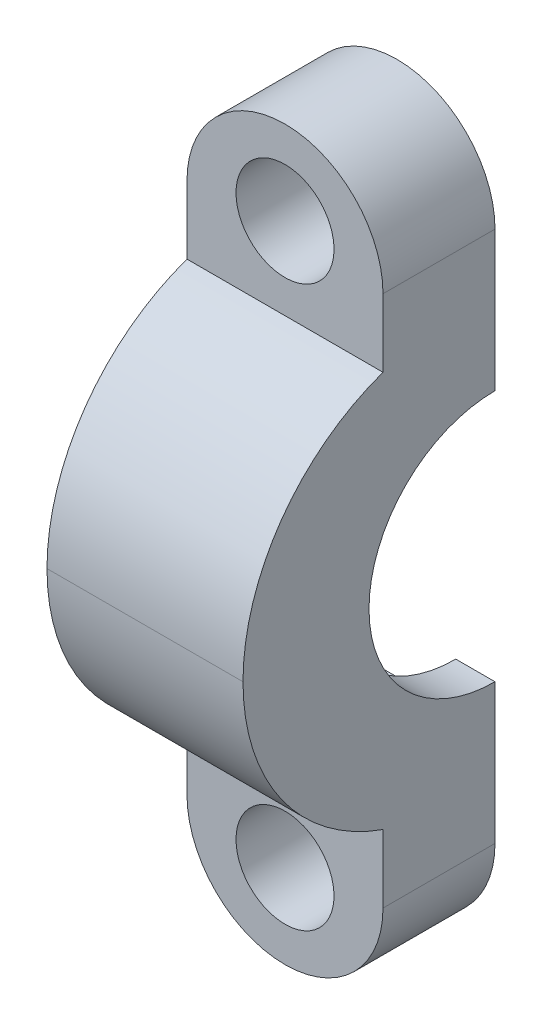
ISO-10303-21;
HEADER;
FILE_DESCRIPTION(('STEP AP214'),'2;1');
FILE_NAME('part.step','',(''),(''),'','','');
FILE_SCHEMA(('AUTOMOTIVE_DESIGN { 1 0 10303 214 1 1 1 1 }'));
ENDSEC;
DATA;
#1=APPLICATION_CONTEXT('core data for automotive mechanical design processes');
#2=APPLICATION_PROTOCOL_DEFINITION('international standard','automotive_design',2000,#1);
#3=PRODUCT_CONTEXT('',#1,'mechanical');
#4=PRODUCT('Part','Part','',(#3));
#5=PRODUCT_RELATED_PRODUCT_CATEGORY('part','',(#4));
#6=PRODUCT_DEFINITION_FORMATION('','',#4);
#7=PRODUCT_DEFINITION_CONTEXT('part definition',#1,'design');
#8=PRODUCT_DEFINITION('design','',#6,#7);
#9=PRODUCT_DEFINITION_SHAPE('','',#8);
#10=(LENGTH_UNIT() NAMED_UNIT(*) SI_UNIT(.MILLI.,.METRE.));
#11=(NAMED_UNIT(*) PLANE_ANGLE_UNIT() SI_UNIT($,.RADIAN.));
#12=(NAMED_UNIT(*) SI_UNIT($,.STERADIAN.) SOLID_ANGLE_UNIT());
#13=UNCERTAINTY_MEASURE_WITH_UNIT(LENGTH_MEASURE(1.E-05),#10,'distance_accuracy_value','');
#14=(GEOMETRIC_REPRESENTATION_CONTEXT(3) GLOBAL_UNCERTAINTY_ASSIGNED_CONTEXT((#13)) GLOBAL_UNIT_ASSIGNED_CONTEXT((#10,
#11,#12)) REPRESENTATION_CONTEXT('',''));
#15=CARTESIAN_POINT('',(0.,0.,0.));
#16=DIRECTION('',(0.,0.,1.));
#17=DIRECTION('',(1.,0.,0.));
#18=AXIS2_PLACEMENT_3D('',#15,#16,#17);
#19=CARTESIAN_POINT('',(0.,0.,1.5));
#20=DIRECTION('',(-1.,0.,0.));
#21=DIRECTION('',(0.,0.,1.));
#22=AXIS2_PLACEMENT_3D('',#19,#20,#21);
#23=CYLINDRICAL_SURFACE('',#22,7.5);
#24=CARTESIAN_POINT('',(-3.5,0.,1.5));
#25=DIRECTION('',(1.,0.,0.));
#26=DIRECTION('',(0.,1.,0.));
#27=AXIS2_PLACEMENT_3D('',#24,#25,#26);
#28=CIRCLE('',#27,7.5);
#29=CARTESIAN_POINT('',(-3.5,-7.07106781186547,4.));
#30=VERTEX_POINT('',#29);
#31=CARTESIAN_POINT('',(-3.5,0.,9.));
#32=VERTEX_POINT('',#31);
#33=EDGE_CURVE('E267',#30,#32,#28,.F.);
#34=ORIENTED_EDGE('',*,*,#33,.F.);
#35=DIRECTION('',(-1.,0.,0.));
#36=VECTOR('',#35,1.);
#37=CARTESIAN_POINT('',(0.,-7.07106781186547,4.));
#38=LINE('',#37,#36);
#39=CARTESIAN_POINT('',(3.5,-7.07106781186547,4.));
#40=VERTEX_POINT('',#39);
#41=EDGE_CURVE('E11',#30,#40,#38,.F.);
#42=ORIENTED_EDGE('',*,*,#41,.T.);
#43=CARTESIAN_POINT('',(3.5,0.,1.5));
#44=DIRECTION('',(-1.,0.,0.));
#45=DIRECTION('',(0.,-1.,0.));
#46=AXIS2_PLACEMENT_3D('',#43,#44,#45);
#47=CIRCLE('',#46,7.5);
#48=CARTESIAN_POINT('',(3.5,0.,9.));
#49=VERTEX_POINT('',#48);
#50=EDGE_CURVE('E259',#49,#40,#47,.F.);
#51=ORIENTED_EDGE('',*,*,#50,.F.);
#52=DIRECTION('',(-1.,0.,0.));
#53=VECTOR('',#52,1.);
#54=CARTESIAN_POINT('',(-3.5,0.,9.));
#55=LINE('',#54,#53);
#56=EDGE_CURVE('E196',#49,#32,#55,.T.);
#57=ORIENTED_EDGE('',*,*,#56,.T.);
#58=EDGE_LOOP('',(#34,#42,#51,#57));
#59=FACE_BOUND('',#58,.T.);
#60=ADVANCED_FACE('F42',(#59),#23,.T.);
#61=CARTESIAN_POINT('',(0.,0.,1.5));
#62=DIRECTION('',(1.,0.,0.));
#63=DIRECTION('',(0.,0.,-1.));
#64=AXIS2_PLACEMENT_3D('',#61,#62,#63);
#65=CYLINDRICAL_SURFACE('',#64,7.5);
#66=CARTESIAN_POINT('',(3.5,0.,1.5));
#67=DIRECTION('',(-1.,0.,0.));
#68=DIRECTION('',(0.,-1.,0.));
#69=AXIS2_PLACEMENT_3D('',#66,#67,#68);
#70=CIRCLE('',#69,7.5);
#71=CARTESIAN_POINT('',(3.5,7.07106781186548,4.));
#72=VERTEX_POINT('',#71);
#73=EDGE_CURVE('E256',#72,#49,#70,.F.);
#74=ORIENTED_EDGE('',*,*,#73,.F.);
#75=DIRECTION('',(1.,0.,0.));
#76=VECTOR('',#75,1.);
#77=CARTESIAN_POINT('',(0.,7.07106781186548,4.));
#78=LINE('',#77,#76);
#79=CARTESIAN_POINT('',(-3.5,7.07106781186548,4.));
#80=VERTEX_POINT('',#79);
#81=EDGE_CURVE('E52',#72,#80,#78,.F.);
#82=ORIENTED_EDGE('',*,*,#81,.T.);
#83=CARTESIAN_POINT('',(-3.5,0.,1.5));
#84=DIRECTION('',(1.,0.,0.));
#85=DIRECTION('',(0.,1.,0.));
#86=AXIS2_PLACEMENT_3D('',#83,#84,#85);
#87=CIRCLE('',#86,7.5);
#88=EDGE_CURVE('E263',#32,#80,#87,.F.);
#89=ORIENTED_EDGE('',*,*,#88,.F.);
#90=ORIENTED_EDGE('',*,*,#56,.F.);
#91=EDGE_LOOP('',(#74,#82,#89,#90));
#92=FACE_BOUND('',#91,.T.);
#93=ADVANCED_FACE('F44',(#92),#65,.T.);
#94=CARTESIAN_POINT('',(-3.5,0.,0.));
#95=DIRECTION('',(1.,0.,0.));
#96=DIRECTION('',(0.,1.,0.));
#97=AXIS2_PLACEMENT_3D('',#94,#95,#96);
#98=CYLINDRICAL_SURFACE('',#97,4.5);
#99=CARTESIAN_POINT('',(-2.1,0.,0.));
#100=DIRECTION('',(1.,0.,0.));
#101=DIRECTION('',(0.,0.,-1.));
#102=AXIS2_PLACEMENT_3D('',#99,#100,#101);
#103=CIRCLE('',#102,4.5);
#104=CARTESIAN_POINT('',(-2.1,-4.5,0.));
#105=VERTEX_POINT('',#104);
#106=CARTESIAN_POINT('',(-2.1,4.5,0.));
#107=VERTEX_POINT('',#106);
#108=EDGE_CURVE('E246',#105,#107,#103,.F.);
#109=ORIENTED_EDGE('',*,*,#108,.F.);
#110=DIRECTION('',(1.,0.,0.));
#111=VECTOR('',#110,1.);
#112=CARTESIAN_POINT('',(-3.5,-4.5,0.));
#113=LINE('',#112,#111);
#114=CARTESIAN_POINT('',(-3.5,-4.5,0.));
#115=VERTEX_POINT('',#114);
#116=EDGE_CURVE('E242',#115,#105,#113,.T.);
#117=ORIENTED_EDGE('',*,*,#116,.F.);
#118=CARTESIAN_POINT('',(-3.5,0.,0.));
#119=DIRECTION('',(1.,0.,0.));
#120=DIRECTION('',(0.,1.,0.));
#121=AXIS2_PLACEMENT_3D('',#118,#119,#120);
#122=CIRCLE('',#121,4.5);
#123=CARTESIAN_POINT('',(-3.5,4.5,0.));
#124=VERTEX_POINT('',#123);
#125=EDGE_CURVE('E223',#124,#115,#122,.T.);
#126=ORIENTED_EDGE('',*,*,#125,.F.);
#127=DIRECTION('',(1.,0.,0.));
#128=VECTOR('',#127,1.);
#129=CARTESIAN_POINT('',(-3.5,4.5,0.));
#130=LINE('',#129,#128);
#131=EDGE_CURVE('E236',#107,#124,#130,.F.);
#132=ORIENTED_EDGE('',*,*,#131,.F.);
#133=EDGE_LOOP('',(#109,#117,#126,#132));
#134=FACE_BOUND('',#133,.T.);
#135=ADVANCED_FACE('F297',(#134),#98,.F.);
#136=CARTESIAN_POINT('',(0.,0.,0.));
#137=DIRECTION('',(0.,0.,1.));
#138=DIRECTION('',(1.,0.,0.));
#139=AXIS2_PLACEMENT_3D('',#136,#137,#138);
#140=PLANE('',#139);
#141=CARTESIAN_POINT('',(0.,-10.,0.));
#142=DIRECTION('',(0.,0.,1.));
#143=DIRECTION('',(-1.,0.,0.));
#144=AXIS2_PLACEMENT_3D('',#141,#142,#143);
#145=CIRCLE('',#144,1.75);
#146=CARTESIAN_POINT('',(-1.75,-10.,0.));
#147=VERTEX_POINT('',#146);
#148=EDGE_CURVE('E370',#147,#147,#145,.T.);
#149=ORIENTED_EDGE('',*,*,#148,.T.);
#150=EDGE_LOOP('',(#149));
#151=FACE_BOUND('',#150,.T.);
#152=CARTESIAN_POINT('',(2.1,-4.5,0.));
#153=VERTEX_POINT('',#152);
#154=CARTESIAN_POINT('',(3.5,-4.5,0.));
#155=VERTEX_POINT('',#154);
#156=EDGE_CURVE('E241',#153,#155,#113,.T.);
#157=ORIENTED_EDGE('',*,*,#156,.T.);
#158=DIRECTION('',(0.,1.,0.));
#159=VECTOR('',#158,1.);
#160=CARTESIAN_POINT('',(3.5,7.5,0.));
#161=LINE('',#160,#159);
#162=CARTESIAN_POINT('',(3.5,-9.5,0.));
#163=VERTEX_POINT('',#162);
#164=EDGE_CURVE('E230',#163,#155,#161,.T.);
#165=ORIENTED_EDGE('',*,*,#164,.F.);
#166=CARTESIAN_POINT('',(0.,-9.5,0.));
#167=DIRECTION('',(0.,0.,-1.));
#168=DIRECTION('',(-1.,0.,0.));
#169=AXIS2_PLACEMENT_3D('',#166,#167,#168);
#170=CIRCLE('',#169,3.5);
#171=CARTESIAN_POINT('',(-3.5,-9.5,0.));
#172=VERTEX_POINT('',#171);
#173=EDGE_CURVE('E157',#163,#172,#170,.T.);
#174=ORIENTED_EDGE('',*,*,#173,.T.);
#175=DIRECTION('',(0.,-1.,0.));
#176=VECTOR('',#175,1.);
#177=CARTESIAN_POINT('',(-3.5,7.5,0.));
#178=LINE('',#177,#176);
#179=EDGE_CURVE('E145',#115,#172,#178,.T.);
#180=ORIENTED_EDGE('',*,*,#179,.F.);
#181=ORIENTED_EDGE('',*,*,#116,.T.);
#182=DIRECTION('',(0.,1.,0.));
#183=VECTOR('',#182,1.);
#184=CARTESIAN_POINT('',(-2.1,0.,0.));
#185=LINE('',#184,#183);
#186=CARTESIAN_POINT('',(-2.1,-6.1,0.));
#187=VERTEX_POINT('',#186);
#188=EDGE_CURVE('E208',#187,#105,#185,.T.);
#189=ORIENTED_EDGE('',*,*,#188,.F.);
#190=DIRECTION('',(-1.,0.,0.));
#191=VECTOR('',#190,1.);
#192=CARTESIAN_POINT('',(2.1,-6.1,0.));
#193=LINE('',#192,#191);
#194=CARTESIAN_POINT('',(2.1,-6.1,0.));
#195=VERTEX_POINT('',#194);
#196=EDGE_CURVE('E219',#195,#187,#193,.T.);
#197=ORIENTED_EDGE('',*,*,#196,.F.);
#198=DIRECTION('',(0.,1.,0.));
#199=VECTOR('',#198,1.);
#200=CARTESIAN_POINT('',(2.1,0.,0.));
#201=LINE('',#200,#199);
#202=EDGE_CURVE('E215',#195,#153,#201,.T.);
#203=ORIENTED_EDGE('',*,*,#202,.T.);
#204=EDGE_LOOP('',(#157,#165,#174,#180,#181,#189,#197,#203));
#205=FACE_BOUND('',#204,.T.);
#206=ADVANCED_FACE('F303',(#151,#205),#140,.F.);
#207=CARTESIAN_POINT('',(3.5,7.5,9.));
#208=DIRECTION('',(-1.,0.,0.));
#209=DIRECTION('',(0.,-1.,0.));
#210=AXIS2_PLACEMENT_3D('',#207,#208,#209);
#211=PLANE('',#210);
#212=ORIENTED_EDGE('',*,*,#164,.T.);
#213=CARTESIAN_POINT('',(3.5,0.,0.));
#214=DIRECTION('',(1.,0.,0.));
#215=DIRECTION('',(0.,1.,0.));
#216=AXIS2_PLACEMENT_3D('',#213,#214,#215);
#217=CIRCLE('',#216,4.5);
#218=CARTESIAN_POINT('',(3.5,4.5,0.));
#219=VERTEX_POINT('',#218);
#220=EDGE_CURVE('E222',#219,#155,#217,.T.);
#221=ORIENTED_EDGE('',*,*,#220,.F.);
#222=CARTESIAN_POINT('',(3.5,9.5,0.));
#223=VERTEX_POINT('',#222);
#224=EDGE_CURVE('E226',#219,#223,#161,.T.);
#225=ORIENTED_EDGE('',*,*,#224,.T.);
#226=DIRECTION('',(0.,0.,-1.));
#227=VECTOR('',#226,1.);
#228=CARTESIAN_POINT('',(3.5,9.5,4.));
#229=LINE('',#228,#227);
#230=CARTESIAN_POINT('',(3.5,9.5,4.));
#231=VERTEX_POINT('',#230);
#232=EDGE_CURVE('E192',#231,#223,#229,.T.);
#233=ORIENTED_EDGE('',*,*,#232,.F.);
#234=DIRECTION('',(0.,1.,0.));
#235=VECTOR('',#234,1.);
#236=CARTESIAN_POINT('',(3.5,6.50728155694935,4.));
#237=LINE('',#236,#235);
#238=EDGE_CURVE('E176',#72,#231,#237,.T.);
#239=ORIENTED_EDGE('',*,*,#238,.F.);
#240=ORIENTED_EDGE('',*,*,#73,.T.);
#241=ORIENTED_EDGE('',*,*,#50,.T.);
#242=DIRECTION('',(0.,-1.,0.));
#243=VECTOR('',#242,1.);
#244=CARTESIAN_POINT('',(3.5,-6.50728155694935,4.));
#245=LINE('',#244,#243);
#246=CARTESIAN_POINT('',(3.5,-9.5,4.));
#247=VERTEX_POINT('',#246);
#248=EDGE_CURVE('E59',#40,#247,#245,.T.);
#249=ORIENTED_EDGE('',*,*,#248,.T.);
#250=DIRECTION('',(0.,0.,-1.));
#251=VECTOR('',#250,1.);
#252=CARTESIAN_POINT('',(3.5,-9.5,4.));
#253=LINE('',#252,#251);
#254=EDGE_CURVE('E152',#247,#163,#253,.T.);
#255=ORIENTED_EDGE('',*,*,#254,.T.);
#256=EDGE_LOOP('',(#212,#221,#225,#233,#239,#240,#241,#249,#255));
#257=FACE_BOUND('',#256,.T.);
#258=ADVANCED_FACE('F300',(#257),#211,.F.);
#259=CARTESIAN_POINT('',(-3.5,7.5,9.));
#260=DIRECTION('',(1.,0.,0.));
#261=DIRECTION('',(0.,1.,0.));
#262=AXIS2_PLACEMENT_3D('',#259,#260,#261);
#263=PLANE('',#262);
#264=ORIENTED_EDGE('',*,*,#179,.T.);
#265=DIRECTION('',(0.,0.,-1.));
#266=VECTOR('',#265,1.);
#267=CARTESIAN_POINT('',(-3.5,-9.5,4.));
#268=LINE('',#267,#266);
#269=CARTESIAN_POINT('',(-3.5,-9.5,4.));
#270=VERTEX_POINT('',#269);
#271=EDGE_CURVE('E138',#270,#172,#268,.T.);
#272=ORIENTED_EDGE('',*,*,#271,.F.);
#273=DIRECTION('',(0.,1.,0.));
#274=VECTOR('',#273,1.);
#275=CARTESIAN_POINT('',(-3.5,-6.50728155694935,4.));
#276=LINE('',#275,#274);
#277=EDGE_CURVE('E141',#270,#30,#276,.T.);
#278=ORIENTED_EDGE('',*,*,#277,.T.);
#279=ORIENTED_EDGE('',*,*,#33,.T.);
#280=ORIENTED_EDGE('',*,*,#88,.T.);
#281=DIRECTION('',(0.,-1.,0.));
#282=VECTOR('',#281,1.);
#283=CARTESIAN_POINT('',(-3.5,6.50728155694935,4.));
#284=LINE('',#283,#282);
#285=CARTESIAN_POINT('',(-3.5,9.5,4.));
#286=VERTEX_POINT('',#285);
#287=EDGE_CURVE('E66',#286,#80,#284,.T.);
#288=ORIENTED_EDGE('',*,*,#287,.F.);
#289=DIRECTION('',(0.,0.,-1.));
#290=VECTOR('',#289,1.);
#291=CARTESIAN_POINT('',(-3.5,9.5,4.));
#292=LINE('',#291,#290);
#293=CARTESIAN_POINT('',(-3.5,9.5,0.));
#294=VERTEX_POINT('',#293);
#295=EDGE_CURVE('E185',#286,#294,#292,.T.);
#296=ORIENTED_EDGE('',*,*,#295,.T.);
#297=EDGE_CURVE('E233',#294,#124,#178,.T.);
#298=ORIENTED_EDGE('',*,*,#297,.T.);
#299=ORIENTED_EDGE('',*,*,#125,.T.);
#300=EDGE_LOOP('',(#264,#272,#278,#279,#280,#288,#296,#298,#299));
#301=FACE_BOUND('',#300,.T.);
#302=ADVANCED_FACE('F140',(#301),#263,.F.);
#303=CARTESIAN_POINT('',(0.,10.,0.));
#304=DIRECTION('',(0.,0.,-1.));
#305=DIRECTION('',(-1.,0.,0.));
#306=AXIS2_PLACEMENT_3D('',#303,#304,#305);
#307=CIRCLE('',#306,1.75);
#308=CARTESIAN_POINT('',(-1.75,10.,0.));
#309=VERTEX_POINT('',#308);
#310=EDGE_CURVE('E151',#309,#309,#307,.T.);
#311=ORIENTED_EDGE('',*,*,#310,.F.);
#312=EDGE_LOOP('',(#311));
#313=FACE_BOUND('',#312,.T.);
#314=CARTESIAN_POINT('',(0.,9.5,0.));
#315=DIRECTION('',(0.,0.,1.));
#316=DIRECTION('',(-1.,0.,0.));
#317=AXIS2_PLACEMENT_3D('',#314,#315,#316);
#318=CIRCLE('',#317,3.5);
#319=EDGE_CURVE('E180',#223,#294,#318,.T.);
#320=ORIENTED_EDGE('',*,*,#319,.F.);
#321=ORIENTED_EDGE('',*,*,#224,.F.);
#322=CARTESIAN_POINT('',(2.1,4.5,0.));
#323=VERTEX_POINT('',#322);
#324=EDGE_CURVE('E237',#219,#323,#130,.F.);
#325=ORIENTED_EDGE('',*,*,#324,.T.);
#326=DIRECTION('',(0.,1.,0.));
#327=VECTOR('',#326,1.);
#328=CARTESIAN_POINT('',(2.1,0.,0.));
#329=LINE('',#328,#327);
#330=CARTESIAN_POINT('',(2.1,6.1,0.));
#331=VERTEX_POINT('',#330);
#332=EDGE_CURVE('E211',#323,#331,#329,.T.);
#333=ORIENTED_EDGE('',*,*,#332,.T.);
#334=DIRECTION('',(-1.,0.,0.));
#335=VECTOR('',#334,1.);
#336=CARTESIAN_POINT('',(2.1,6.1,0.));
#337=LINE('',#336,#335);
#338=CARTESIAN_POINT('',(-2.1,6.1,0.));
#339=VERTEX_POINT('',#338);
#340=EDGE_CURVE('E253',#339,#331,#337,.F.);
#341=ORIENTED_EDGE('',*,*,#340,.F.);
#342=DIRECTION('',(0.,1.,0.));
#343=VECTOR('',#342,1.);
#344=CARTESIAN_POINT('',(-2.1,0.,0.));
#345=LINE('',#344,#343);
#346=EDGE_CURVE('E205',#107,#339,#345,.T.);
#347=ORIENTED_EDGE('',*,*,#346,.F.);
#348=ORIENTED_EDGE('',*,*,#131,.T.);
#349=ORIENTED_EDGE('',*,*,#297,.F.);
#350=EDGE_LOOP('',(#320,#321,#325,#333,#341,#347,#348,#349));
#351=FACE_BOUND('',#350,.T.);
#352=ADVANCED_FACE('F307',(#313,#351),#140,.F.);
#353=ORIENTED_EDGE('',*,*,#156,.F.);
#354=CARTESIAN_POINT('',(2.1,0.,0.));
#355=DIRECTION('',(1.,0.,0.));
#356=DIRECTION('',(0.,0.,-1.));
#357=AXIS2_PLACEMENT_3D('',#354,#355,#356);
#358=CIRCLE('',#357,4.5);
#359=EDGE_CURVE('E249',#153,#323,#358,.F.);
#360=ORIENTED_EDGE('',*,*,#359,.T.);
#361=ORIENTED_EDGE('',*,*,#324,.F.);
#362=ORIENTED_EDGE('',*,*,#220,.T.);
#363=EDGE_LOOP('',(#353,#360,#361,#362));
#364=FACE_BOUND('',#363,.T.);
#365=ADVANCED_FACE('F310',(#364),#98,.F.);
#366=CARTESIAN_POINT('',(2.1,0.,0.));
#367=DIRECTION('',(-1.,0.,0.));
#368=DIRECTION('',(0.,0.,1.));
#369=AXIS2_PLACEMENT_3D('',#366,#367,#368);
#370=CYLINDRICAL_SURFACE('',#369,6.1);
#371=ORIENTED_EDGE('',*,*,#196,.T.);
#372=CARTESIAN_POINT('',(-2.1,0.,0.));
#373=DIRECTION('',(1.,0.,0.));
#374=DIRECTION('',(0.,0.,-1.));
#375=AXIS2_PLACEMENT_3D('',#372,#373,#374);
#376=CIRCLE('',#375,6.1);
#377=EDGE_CURVE('E197',#339,#187,#376,.T.);
#378=ORIENTED_EDGE('',*,*,#377,.F.);
#379=ORIENTED_EDGE('',*,*,#340,.T.);
#380=CARTESIAN_POINT('',(2.1,0.,0.));
#381=DIRECTION('',(1.,0.,0.));
#382=DIRECTION('',(0.,0.,-1.));
#383=AXIS2_PLACEMENT_3D('',#380,#381,#382);
#384=CIRCLE('',#383,6.1);
#385=EDGE_CURVE('E201',#331,#195,#384,.T.);
#386=ORIENTED_EDGE('',*,*,#385,.T.);
#387=EDGE_LOOP('',(#371,#378,#379,#386));
#388=FACE_BOUND('',#387,.T.);
#389=ADVANCED_FACE('F314',(#388),#370,.F.);
#390=CARTESIAN_POINT('',(2.1,0.,0.));
#391=DIRECTION('',(1.,0.,0.));
#392=DIRECTION('',(0.,0.,-1.));
#393=AXIS2_PLACEMENT_3D('',#390,#391,#392);
#394=PLANE('',#393);
#395=ORIENTED_EDGE('',*,*,#385,.F.);
#396=ORIENTED_EDGE('',*,*,#332,.F.);
#397=ORIENTED_EDGE('',*,*,#359,.F.);
#398=ORIENTED_EDGE('',*,*,#202,.F.);
#399=EDGE_LOOP('',(#395,#396,#397,#398));
#400=FACE_BOUND('',#399,.T.);
#401=ADVANCED_FACE('F318',(#400),#394,.F.);
#402=CARTESIAN_POINT('',(-2.1,0.,0.));
#403=DIRECTION('',(1.,0.,0.));
#404=DIRECTION('',(0.,0.,-1.));
#405=AXIS2_PLACEMENT_3D('',#402,#403,#404);
#406=PLANE('',#405);
#407=ORIENTED_EDGE('',*,*,#188,.T.);
#408=ORIENTED_EDGE('',*,*,#108,.T.);
#409=ORIENTED_EDGE('',*,*,#346,.T.);
#410=ORIENTED_EDGE('',*,*,#377,.T.);
#411=EDGE_LOOP('',(#407,#408,#409,#410));
#412=FACE_BOUND('',#411,.T.);
#413=ADVANCED_FACE('F322',(#412),#406,.T.);
#414=CARTESIAN_POINT('',(0.,9.5,4.));
#415=DIRECTION('',(0.,0.,-1.));
#416=DIRECTION('',(-1.,0.,0.));
#417=AXIS2_PLACEMENT_3D('',#414,#415,#416);
#418=CYLINDRICAL_SURFACE('',#417,3.5);
#419=ORIENTED_EDGE('',*,*,#319,.T.);
#420=ORIENTED_EDGE('',*,*,#295,.F.);
#421=CARTESIAN_POINT('',(0.,9.5,4.));
#422=DIRECTION('',(0.,0.,1.));
#423=DIRECTION('',(-1.,0.,0.));
#424=AXIS2_PLACEMENT_3D('',#421,#422,#423);
#425=CIRCLE('',#424,3.5);
#426=EDGE_CURVE('E179',#231,#286,#425,.T.);
#427=ORIENTED_EDGE('',*,*,#426,.F.);
#428=ORIENTED_EDGE('',*,*,#232,.T.);
#429=EDGE_LOOP('',(#419,#420,#427,#428));
#430=FACE_BOUND('',#429,.T.);
#431=ADVANCED_FACE('F290',(#430),#418,.T.);
#432=CARTESIAN_POINT('',(0.,9.5,4.));
#433=DIRECTION('',(0.,0.,-1.));
#434=DIRECTION('',(-1.,0.,0.));
#435=AXIS2_PLACEMENT_3D('',#432,#433,#434);
#436=PLANE('',#435);
#437=CARTESIAN_POINT('',(0.,10.,4.));
#438=DIRECTION('',(0.,0.,-1.));
#439=DIRECTION('',(-1.,0.,0.));
#440=AXIS2_PLACEMENT_3D('',#437,#438,#439);
#441=CIRCLE('',#440,1.75);
#442=CARTESIAN_POINT('',(-1.75,10.,4.));
#443=VERTEX_POINT('',#442);
#444=EDGE_CURVE('E175',#443,#443,#441,.T.);
#445=ORIENTED_EDGE('',*,*,#444,.T.);
#446=EDGE_LOOP('',(#445));
#447=FACE_BOUND('',#446,.T.);
#448=ORIENTED_EDGE('',*,*,#81,.F.);
#449=ORIENTED_EDGE('',*,*,#238,.T.);
#450=ORIENTED_EDGE('',*,*,#426,.T.);
#451=ORIENTED_EDGE('',*,*,#287,.T.);
#452=EDGE_LOOP('',(#448,#449,#450,#451));
#453=FACE_BOUND('',#452,.T.);
#454=ADVANCED_FACE('F279',(#447,#453),#436,.F.);
#455=CARTESIAN_POINT('',(0.,10.,9.));
#456=DIRECTION('',(0.,0.,-1.));
#457=DIRECTION('',(-1.,0.,0.));
#458=AXIS2_PLACEMENT_3D('',#455,#456,#457);
#459=CYLINDRICAL_SURFACE('',#458,1.75);
#460=ORIENTED_EDGE('',*,*,#310,.T.);
#461=EDGE_LOOP('',(#460));
#462=FACE_BOUND('',#461,.T.);
#463=ORIENTED_EDGE('',*,*,#444,.F.);
#464=EDGE_LOOP('',(#463));
#465=FACE_BOUND('',#464,.T.);
#466=ADVANCED_FACE('F281',(#462,#465),#459,.F.);
#467=CARTESIAN_POINT('',(0.,-9.5,4.));
#468=DIRECTION('',(0.,0.,-1.));
#469=DIRECTION('',(-1.,0.,0.));
#470=AXIS2_PLACEMENT_3D('',#467,#468,#469);
#471=CYLINDRICAL_SURFACE('',#470,3.5);
#472=ORIENTED_EDGE('',*,*,#173,.F.);
#473=ORIENTED_EDGE('',*,*,#254,.F.);
#474=CARTESIAN_POINT('',(0.,-9.5,4.));
#475=DIRECTION('',(0.,0.,-1.));
#476=DIRECTION('',(-1.,0.,0.));
#477=AXIS2_PLACEMENT_3D('',#474,#475,#476);
#478=CIRCLE('',#477,3.5);
#479=EDGE_CURVE('E155',#247,#270,#478,.T.);
#480=ORIENTED_EDGE('',*,*,#479,.T.);
#481=ORIENTED_EDGE('',*,*,#271,.T.);
#482=EDGE_LOOP('',(#472,#473,#480,#481));
#483=FACE_BOUND('',#482,.T.);
#484=ADVANCED_FACE('F160',(#483),#471,.T.);
#485=CARTESIAN_POINT('',(0.,-9.5,4.));
#486=DIRECTION('',(0.,0.,-1.));
#487=DIRECTION('',(-1.,0.,0.));
#488=AXIS2_PLACEMENT_3D('',#485,#486,#487);
#489=PLANE('',#488);
#490=CARTESIAN_POINT('',(0.,-10.,4.));
#491=DIRECTION('',(0.,0.,-1.));
#492=DIRECTION('',(-1.,0.,0.));
#493=AXIS2_PLACEMENT_3D('',#490,#491,#492);
#494=CIRCLE('',#493,1.75);
#495=CARTESIAN_POINT('',(-1.75,-10.,4.));
#496=VERTEX_POINT('',#495);
#497=EDGE_CURVE('E46',#496,#496,#494,.F.);
#498=ORIENTED_EDGE('',*,*,#497,.F.);
#499=EDGE_LOOP('',(#498));
#500=FACE_BOUND('',#499,.T.);
#501=ORIENTED_EDGE('',*,*,#41,.F.);
#502=ORIENTED_EDGE('',*,*,#277,.F.);
#503=ORIENTED_EDGE('',*,*,#479,.F.);
#504=ORIENTED_EDGE('',*,*,#248,.F.);
#505=EDGE_LOOP('',(#501,#502,#503,#504));
#506=FACE_BOUND('',#505,.T.);
#507=ADVANCED_FACE('F154',(#500,#506),#489,.F.);
#508=CARTESIAN_POINT('',(0.,-10.,9.));
#509=DIRECTION('',(0.,0.,-1.));
#510=DIRECTION('',(-1.,0.,0.));
#511=AXIS2_PLACEMENT_3D('',#508,#509,#510);
#512=CYLINDRICAL_SURFACE('',#511,1.75);
#513=ORIENTED_EDGE('',*,*,#148,.F.);
#514=EDGE_LOOP('',(#513));
#515=FACE_BOUND('',#514,.T.);
#516=ORIENTED_EDGE('',*,*,#497,.T.);
#517=EDGE_LOOP('',(#516));
#518=FACE_BOUND('',#517,.T.);
#519=ADVANCED_FACE('F377',(#515,#518),#512,.F.);
#520=CLOSED_SHELL('',(#60,#93,#135,#206,#258,#302,#352,#365,#389,#401,#413,#431,#454,#466,#484,
#507,#519));
#521=MANIFOLD_SOLID_BREP('B2',#520);
#522=ADVANCED_BREP_SHAPE_REPRESENTATION('',(#18,#521),#14);
#523=SHAPE_DEFINITION_REPRESENTATION(#9,#522);
ENDSEC;
END-ISO-10303-21;
